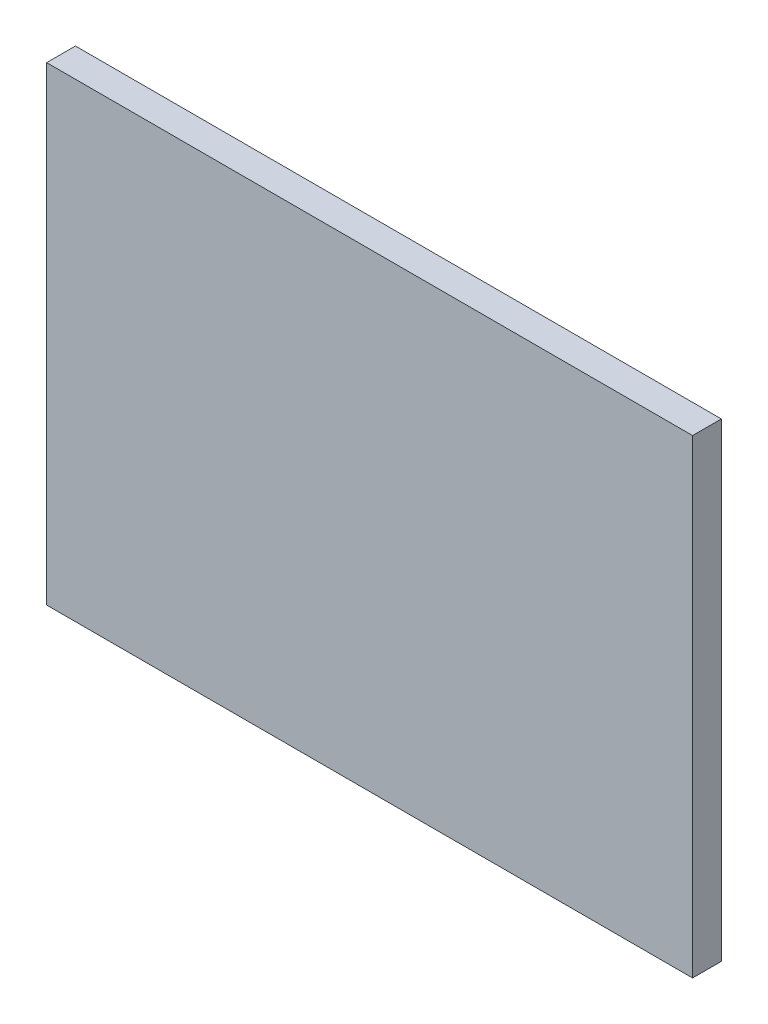
ISO-10303-21;
HEADER;
FILE_DESCRIPTION(('STEP AP214'),'2;1');
FILE_NAME('part.step','',(''),(''),'','','');
FILE_SCHEMA(('AUTOMOTIVE_DESIGN { 1 0 10303 214 1 1 1 1 }'));
ENDSEC;
DATA;
#1=APPLICATION_CONTEXT('core data for automotive mechanical design processes');
#2=APPLICATION_PROTOCOL_DEFINITION('international standard','automotive_design',2000,#1);
#3=PRODUCT_CONTEXT('',#1,'mechanical');
#4=PRODUCT('Part','Part','',(#3));
#5=PRODUCT_RELATED_PRODUCT_CATEGORY('part','',(#4));
#6=PRODUCT_DEFINITION_FORMATION('','',#4);
#7=PRODUCT_DEFINITION_CONTEXT('part definition',#1,'design');
#8=PRODUCT_DEFINITION('design','',#6,#7);
#9=PRODUCT_DEFINITION_SHAPE('','',#8);
#10=(LENGTH_UNIT() NAMED_UNIT(*) SI_UNIT(.MILLI.,.METRE.));
#11=(NAMED_UNIT(*) PLANE_ANGLE_UNIT() SI_UNIT($,.RADIAN.));
#12=(NAMED_UNIT(*) SI_UNIT($,.STERADIAN.) SOLID_ANGLE_UNIT());
#13=UNCERTAINTY_MEASURE_WITH_UNIT(LENGTH_MEASURE(1.E-05),#10,'distance_accuracy_value','');
#14=(GEOMETRIC_REPRESENTATION_CONTEXT(3) GLOBAL_UNCERTAINTY_ASSIGNED_CONTEXT((#13)) GLOBAL_UNIT_ASSIGNED_CONTEXT((#10,
#11,#12)) REPRESENTATION_CONTEXT('',''));
#15=CARTESIAN_POINT('',(0.,0.,0.));
#16=DIRECTION('',(0.,0.,1.));
#17=DIRECTION('',(1.,0.,0.));
#18=AXIS2_PLACEMENT_3D('',#15,#16,#17);
#19=CARTESIAN_POINT('',(0.,-0.4,0.401));
#20=DIRECTION('',(0.,0.,1.));
#21=DIRECTION('',(1.,0.,0.));
#22=AXIS2_PLACEMENT_3D('',#19,#20,#21);
#23=PLANE('',#22);
#24=DIRECTION('',(0.,1.,0.));
#25=VECTOR('',#24,1.);
#26=CARTESIAN_POINT('',(0.55,-0.4,0.401));
#27=LINE('',#26,#25);
#28=CARTESIAN_POINT('',(0.55,0.4,0.401));
#29=VERTEX_POINT('',#28);
#30=CARTESIAN_POINT('',(0.55,-0.4,0.401));
#31=VERTEX_POINT('',#30);
#32=EDGE_CURVE('E79',#29,#31,#27,.F.);
#33=ORIENTED_EDGE('',*,*,#32,.T.);
#34=DIRECTION('',(1.,0.,0.));
#35=VECTOR('',#34,1.);
#36=CARTESIAN_POINT('',(0.,-0.4,0.401));
#37=LINE('',#36,#35);
#38=CARTESIAN_POINT('',(-0.55,-0.4,0.401));
#39=VERTEX_POINT('',#38);
#40=EDGE_CURVE('E68',#39,#31,#37,.T.);
#41=ORIENTED_EDGE('',*,*,#40,.F.);
#42=DIRECTION('',(0.,1.,0.));
#43=VECTOR('',#42,1.);
#44=CARTESIAN_POINT('',(-0.55,-0.4,0.401));
#45=LINE('',#44,#43);
#46=CARTESIAN_POINT('',(-0.55,0.4,0.401));
#47=VERTEX_POINT('',#46);
#48=EDGE_CURVE('E56',#47,#39,#45,.F.);
#49=ORIENTED_EDGE('',*,*,#48,.F.);
#50=DIRECTION('',(1.,0.,0.));
#51=VECTOR('',#50,1.);
#52=CARTESIAN_POINT('',(0.,0.4,0.401));
#53=LINE('',#52,#51);
#54=EDGE_CURVE('E20',#47,#29,#53,.T.);
#55=ORIENTED_EDGE('',*,*,#54,.T.);
#56=EDGE_LOOP('',(#33,#41,#49,#55));
#57=FACE_BOUND('',#56,.T.);
#58=ADVANCED_FACE('F17',(#57),#23,.F.);
#59=CARTESIAN_POINT('',(0.,0.4,0.4255));
#60=DIRECTION('',(0.,-1.,0.));
#61=DIRECTION('',(0.,0.,-1.));
#62=AXIS2_PLACEMENT_3D('',#59,#60,#61);
#63=PLANE('',#62);
#64=DIRECTION('',(1.,0.,0.));
#65=VECTOR('',#64,1.);
#66=CARTESIAN_POINT('',(0.,0.4,0.45));
#67=LINE('',#66,#65);
#68=CARTESIAN_POINT('',(0.55,0.4,0.45));
#69=VERTEX_POINT('',#68);
#70=CARTESIAN_POINT('',(-0.55,0.4,0.45));
#71=VERTEX_POINT('',#70);
#72=EDGE_CURVE('E83',#69,#71,#67,.F.);
#73=ORIENTED_EDGE('',*,*,#72,.F.);
#74=DIRECTION('',(0.,0.,1.));
#75=VECTOR('',#74,1.);
#76=CARTESIAN_POINT('',(0.55,0.4,0.4255));
#77=LINE('',#76,#75);
#78=EDGE_CURVE('E65',#69,#29,#77,.F.);
#79=ORIENTED_EDGE('',*,*,#78,.T.);
#80=ORIENTED_EDGE('',*,*,#54,.F.);
#81=DIRECTION('',(0.,0.,1.));
#82=VECTOR('',#81,1.);
#83=CARTESIAN_POINT('',(-0.55,0.4,0.4255));
#84=LINE('',#83,#82);
#85=EDGE_CURVE('E62',#71,#47,#84,.F.);
#86=ORIENTED_EDGE('',*,*,#85,.F.);
#87=EDGE_LOOP('',(#73,#79,#80,#86));
#88=FACE_BOUND('',#87,.T.);
#89=ADVANCED_FACE('F61',(#88),#63,.F.);
#90=CARTESIAN_POINT('',(-0.55,-0.4,0.4255));
#91=DIRECTION('',(-1.,0.,0.));
#92=DIRECTION('',(0.,0.,1.));
#93=AXIS2_PLACEMENT_3D('',#90,#91,#92);
#94=PLANE('',#93);
#95=DIRECTION('',(0.,0.,-1.));
#96=VECTOR('',#95,1.);
#97=CARTESIAN_POINT('',(-0.55,-0.4,0.4255));
#98=LINE('',#97,#96);
#99=CARTESIAN_POINT('',(-0.55,-0.4,0.45));
#100=VERTEX_POINT('',#99);
#101=EDGE_CURVE('E70',#100,#39,#98,.T.);
#102=ORIENTED_EDGE('',*,*,#101,.F.);
#103=DIRECTION('',(0.,1.,0.));
#104=VECTOR('',#103,1.);
#105=CARTESIAN_POINT('',(-0.55,-0.4,0.45));
#106=LINE('',#105,#104);
#107=EDGE_CURVE('E74',#71,#100,#106,.F.);
#108=ORIENTED_EDGE('',*,*,#107,.F.);
#109=ORIENTED_EDGE('',*,*,#85,.T.);
#110=ORIENTED_EDGE('',*,*,#48,.T.);
#111=EDGE_LOOP('',(#102,#108,#109,#110));
#112=FACE_BOUND('',#111,.T.);
#113=ADVANCED_FACE('F72',(#112),#94,.T.);
#114=CARTESIAN_POINT('',(0.,-0.4,0.4255));
#115=DIRECTION('',(0.,-1.,0.));
#116=DIRECTION('',(0.,0.,-1.));
#117=AXIS2_PLACEMENT_3D('',#114,#115,#116);
#118=PLANE('',#117);
#119=DIRECTION('',(0.,0.,1.));
#120=VECTOR('',#119,1.);
#121=CARTESIAN_POINT('',(0.55,-0.4,0.4255));
#122=LINE('',#121,#120);
#123=CARTESIAN_POINT('',(0.55,-0.4,0.45));
#124=VERTEX_POINT('',#123);
#125=EDGE_CURVE('E35',#31,#124,#122,.T.);
#126=ORIENTED_EDGE('',*,*,#125,.T.);
#127=DIRECTION('',(1.,0.,0.));
#128=VECTOR('',#127,1.);
#129=CARTESIAN_POINT('',(0.,-0.4,0.45));
#130=LINE('',#129,#128);
#131=EDGE_CURVE('E26',#100,#124,#130,.T.);
#132=ORIENTED_EDGE('',*,*,#131,.F.);
#133=ORIENTED_EDGE('',*,*,#101,.T.);
#134=ORIENTED_EDGE('',*,*,#40,.T.);
#135=EDGE_LOOP('',(#126,#132,#133,#134));
#136=FACE_BOUND('',#135,.T.);
#137=ADVANCED_FACE('F89',(#136),#118,.T.);
#138=CARTESIAN_POINT('',(0.55,-0.4,0.4255));
#139=DIRECTION('',(-1.,0.,0.));
#140=DIRECTION('',(0.,0.,1.));
#141=AXIS2_PLACEMENT_3D('',#138,#139,#140);
#142=PLANE('',#141);
#143=DIRECTION('',(0.,1.,0.));
#144=VECTOR('',#143,1.);
#145=CARTESIAN_POINT('',(0.55,-0.4,0.45));
#146=LINE('',#145,#144);
#147=EDGE_CURVE('E11',#124,#69,#146,.T.);
#148=ORIENTED_EDGE('',*,*,#147,.F.);
#149=ORIENTED_EDGE('',*,*,#125,.F.);
#150=ORIENTED_EDGE('',*,*,#32,.F.);
#151=ORIENTED_EDGE('',*,*,#78,.F.);
#152=EDGE_LOOP('',(#148,#149,#150,#151));
#153=FACE_BOUND('',#152,.T.);
#154=ADVANCED_FACE('F91',(#153),#142,.F.);
#155=CARTESIAN_POINT('',(0.,-0.4,0.45));
#156=DIRECTION('',(0.,0.,1.));
#157=DIRECTION('',(1.,0.,0.));
#158=AXIS2_PLACEMENT_3D('',#155,#156,#157);
#159=PLANE('',#158);
#160=ORIENTED_EDGE('',*,*,#131,.T.);
#161=ORIENTED_EDGE('',*,*,#147,.T.);
#162=ORIENTED_EDGE('',*,*,#72,.T.);
#163=ORIENTED_EDGE('',*,*,#107,.T.);
#164=EDGE_LOOP('',(#160,#161,#162,#163));
#165=FACE_BOUND('',#164,.T.);
#166=ADVANCED_FACE('F88',(#165),#159,.T.);
#167=CLOSED_SHELL('',(#58,#89,#113,#137,#154,#166));
#168=MANIFOLD_SOLID_BREP('B1',#167);
#169=ADVANCED_BREP_SHAPE_REPRESENTATION('',(#18,#168),#14);
#170=SHAPE_DEFINITION_REPRESENTATION(#9,#169);
ENDSEC;
END-ISO-10303-21;
